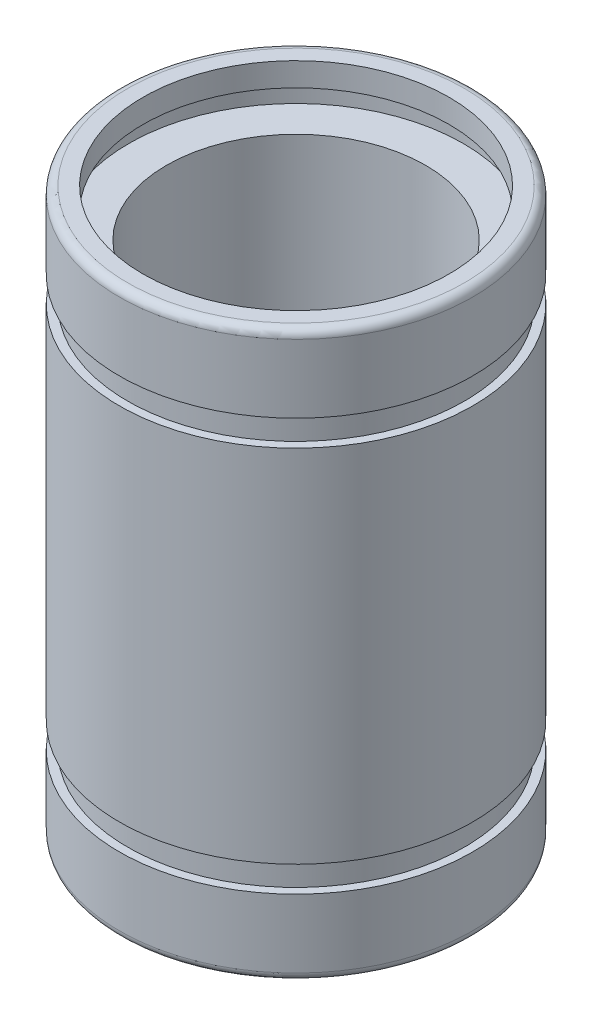
ISO-10303-21;
HEADER;
FILE_DESCRIPTION(('STEP AP214'),'2;1');
FILE_NAME('part.step','',(''),(''),'','','');
FILE_SCHEMA(('AUTOMOTIVE_DESIGN { 1 0 10303 214 1 1 1 1 }'));
ENDSEC;
DATA;
#1=APPLICATION_CONTEXT('core data for automotive mechanical design processes');
#2=APPLICATION_PROTOCOL_DEFINITION('international standard','automotive_design',2000,#1);
#3=PRODUCT_CONTEXT('',#1,'mechanical');
#4=PRODUCT('Part','Part','',(#3));
#5=PRODUCT_RELATED_PRODUCT_CATEGORY('part','',(#4));
#6=PRODUCT_DEFINITION_FORMATION('','',#4);
#7=PRODUCT_DEFINITION_CONTEXT('part definition',#1,'design');
#8=PRODUCT_DEFINITION('design','',#6,#7);
#9=PRODUCT_DEFINITION_SHAPE('','',#8);
#10=(LENGTH_UNIT() NAMED_UNIT(*) SI_UNIT(.MILLI.,.METRE.));
#11=(NAMED_UNIT(*) PLANE_ANGLE_UNIT() SI_UNIT($,.RADIAN.));
#12=(NAMED_UNIT(*) SI_UNIT($,.STERADIAN.) SOLID_ANGLE_UNIT());
#13=UNCERTAINTY_MEASURE_WITH_UNIT(LENGTH_MEASURE(1.E-05),#10,'distance_accuracy_value','');
#14=(GEOMETRIC_REPRESENTATION_CONTEXT(3) GLOBAL_UNCERTAINTY_ASSIGNED_CONTEXT((#13)) GLOBAL_UNIT_ASSIGNED_CONTEXT((#10,
#11,#12)) REPRESENTATION_CONTEXT('',''));
#15=CARTESIAN_POINT('',(0.,0.,0.));
#16=DIRECTION('',(0.,0.,1.));
#17=DIRECTION('',(1.,0.,0.));
#18=AXIS2_PLACEMENT_3D('',#15,#16,#17);
#19=CARTESIAN_POINT('',(0.,12.,0.));
#20=DIRECTION('',(0.,-1.,0.));
#21=DIRECTION('',(0.,0.,-1.));
#22=AXIS2_PLACEMENT_3D('',#19,#20,#21);
#23=CYLINDRICAL_SURFACE('',#22,7.49999999999999);
#24=CARTESIAN_POINT('',(0.,11.65,0.));
#25=DIRECTION('',(0.,-1.,0.));
#26=DIRECTION('',(0.,0.,-1.));
#27=AXIS2_PLACEMENT_3D('',#24,#25,#26);
#28=CIRCLE('',#27,7.49999999999999);
#29=CARTESIAN_POINT('',(0.,11.65,-7.5));
#30=VERTEX_POINT('',#29);
#31=EDGE_CURVE('E10',#30,#30,#28,.T.);
#32=ORIENTED_EDGE('',*,*,#31,.T.);
#33=EDGE_LOOP('',(#32));
#34=FACE_BOUND('',#33,.T.);
#35=CARTESIAN_POINT('',(0.,8.75,0.));
#36=DIRECTION('',(0.,-1.,0.));
#37=DIRECTION('',(0.,0.,-1.));
#38=AXIS2_PLACEMENT_3D('',#35,#36,#37);
#39=CIRCLE('',#38,7.49999999999999);
#40=CARTESIAN_POINT('',(0.,8.75,-7.5));
#41=VERTEX_POINT('',#40);
#42=EDGE_CURVE('E103',#41,#41,#39,.T.);
#43=ORIENTED_EDGE('',*,*,#42,.F.);
#44=EDGE_LOOP('',(#43));
#45=FACE_BOUND('',#44,.T.);
#46=ADVANCED_FACE('F33',(#34,#45),#23,.T.);
#47=CARTESIAN_POINT('',(0.,11.65,0.));
#48=DIRECTION('',(0.,-1.,0.));
#49=DIRECTION('',(0.,0.,-1.));
#50=AXIS2_PLACEMENT_3D('',#47,#48,#49);
#51=TOROIDAL_SURFACE('',#50,7.14999999999999,0.350000000000003);
#52=CARTESIAN_POINT('',(0.,12.,0.));
#53=DIRECTION('',(0.,-1.,0.));
#54=DIRECTION('',(0.,0.,-1.));
#55=AXIS2_PLACEMENT_3D('',#52,#53,#54);
#56=CIRCLE('',#55,7.14999999999999);
#57=CARTESIAN_POINT('',(0.,12.,-7.15));
#58=VERTEX_POINT('',#57);
#59=EDGE_CURVE('E39',#58,#58,#56,.T.);
#60=ORIENTED_EDGE('',*,*,#59,.T.);
#61=EDGE_LOOP('',(#60));
#62=FACE_BOUND('',#61,.T.);
#63=ORIENTED_EDGE('',*,*,#31,.F.);
#64=EDGE_LOOP('',(#63));
#65=FACE_BOUND('',#64,.T.);
#66=ADVANCED_FACE('F111',(#62,#65),#51,.T.);
#67=CARTESIAN_POINT('',(0.,12.,0.));
#68=DIRECTION('',(0.,1.,0.));
#69=DIRECTION('',(0.,0.,1.));
#70=AXIS2_PLACEMENT_3D('',#67,#68,#69);
#71=PLANE('',#70);
#72=CARTESIAN_POINT('',(0.,12.,0.));
#73=DIRECTION('',(0.,-1.,0.));
#74=DIRECTION('',(0.,0.,-1.));
#75=AXIS2_PLACEMENT_3D('',#72,#73,#74);
#76=CIRCLE('',#75,6.49999999999999);
#77=CARTESIAN_POINT('',(0.,12.,-6.5));
#78=VERTEX_POINT('',#77);
#79=EDGE_CURVE('E43',#78,#78,#76,.T.);
#80=ORIENTED_EDGE('',*,*,#79,.T.);
#81=EDGE_LOOP('',(#80));
#82=FACE_BOUND('',#81,.T.);
#83=ORIENTED_EDGE('',*,*,#59,.F.);
#84=EDGE_LOOP('',(#83));
#85=FACE_BOUND('',#84,.T.);
#86=ADVANCED_FACE('F115',(#82,#85),#71,.T.);
#87=CARTESIAN_POINT('',(0.,12.,0.));
#88=DIRECTION('',(0.,-1.,0.));
#89=DIRECTION('',(0.,0.,-1.));
#90=AXIS2_PLACEMENT_3D('',#87,#88,#89);
#91=CYLINDRICAL_SURFACE('',#90,6.49999999999999);
#92=CARTESIAN_POINT('',(0.,11.,0.));
#93=DIRECTION('',(0.,-1.,0.));
#94=DIRECTION('',(0.,0.,-1.));
#95=AXIS2_PLACEMENT_3D('',#92,#93,#94);
#96=CIRCLE('',#95,6.49999999999999);
#97=CARTESIAN_POINT('',(0.,11.,-6.5));
#98=VERTEX_POINT('',#97);
#99=EDGE_CURVE('E47',#98,#98,#96,.T.);
#100=ORIENTED_EDGE('',*,*,#99,.T.);
#101=EDGE_LOOP('',(#100));
#102=FACE_BOUND('',#101,.T.);
#103=ORIENTED_EDGE('',*,*,#79,.F.);
#104=EDGE_LOOP('',(#103));
#105=FACE_BOUND('',#104,.T.);
#106=ADVANCED_FACE('F119',(#102,#105),#91,.F.);
#107=CARTESIAN_POINT('',(0.,11.,0.));
#108=DIRECTION('',(0.,-1.,0.));
#109=DIRECTION('',(0.,0.,-1.));
#110=AXIS2_PLACEMENT_3D('',#107,#108,#109);
#111=PLANE('',#110);
#112=CARTESIAN_POINT('',(0.,11.,0.));
#113=DIRECTION('',(0.,-1.,0.));
#114=DIRECTION('',(0.,0.,-1.));
#115=AXIS2_PLACEMENT_3D('',#112,#113,#114);
#116=CIRCLE('',#115,7.1);
#117=CARTESIAN_POINT('',(0.,11.,-7.1));
#118=VERTEX_POINT('',#117);
#119=EDGE_CURVE('E52',#118,#118,#116,.T.);
#120=ORIENTED_EDGE('',*,*,#119,.T.);
#121=EDGE_LOOP('',(#120));
#122=FACE_BOUND('',#121,.T.);
#123=ORIENTED_EDGE('',*,*,#99,.F.);
#124=EDGE_LOOP('',(#123));
#125=FACE_BOUND('',#124,.T.);
#126=ADVANCED_FACE('F126',(#122,#125),#111,.T.);
#127=CARTESIAN_POINT('',(0.,12.,0.));
#128=DIRECTION('',(0.,-1.,0.));
#129=DIRECTION('',(0.,0.,-1.));
#130=AXIS2_PLACEMENT_3D('',#127,#128,#129);
#131=CYLINDRICAL_SURFACE('',#130,7.1);
#132=CARTESIAN_POINT('',(0.,9.99999999999999,0.));
#133=DIRECTION('',(0.,-1.,0.));
#134=DIRECTION('',(0.,0.,-1.));
#135=AXIS2_PLACEMENT_3D('',#132,#133,#134);
#136=CIRCLE('',#135,7.1);
#137=CARTESIAN_POINT('',(0.,9.99999999999999,-7.1));
#138=VERTEX_POINT('',#137);
#139=EDGE_CURVE('E55',#138,#138,#136,.T.);
#140=ORIENTED_EDGE('',*,*,#139,.T.);
#141=EDGE_LOOP('',(#140));
#142=FACE_BOUND('',#141,.T.);
#143=ORIENTED_EDGE('',*,*,#119,.F.);
#144=EDGE_LOOP('',(#143));
#145=FACE_BOUND('',#144,.T.);
#146=ADVANCED_FACE('F130',(#142,#145),#131,.F.);
#147=CARTESIAN_POINT('',(0.,9.99999999999999,0.));
#148=DIRECTION('',(0.,1.,0.));
#149=DIRECTION('',(0.,0.,1.));
#150=AXIS2_PLACEMENT_3D('',#147,#148,#149);
#151=PLANE('',#150);
#152=CARTESIAN_POINT('',(0.,9.99999999999999,0.));
#153=DIRECTION('',(0.,-1.,0.));
#154=DIRECTION('',(0.,0.,-1.));
#155=AXIS2_PLACEMENT_3D('',#152,#153,#154);
#156=CIRCLE('',#155,5.50000000000001);
#157=CARTESIAN_POINT('',(0.,9.99999999999999,-5.50000000000001));
#158=VERTEX_POINT('',#157);
#159=EDGE_CURVE('E58',#158,#158,#156,.T.);
#160=ORIENTED_EDGE('',*,*,#159,.T.);
#161=EDGE_LOOP('',(#160));
#162=FACE_BOUND('',#161,.T.);
#163=ORIENTED_EDGE('',*,*,#139,.F.);
#164=EDGE_LOOP('',(#163));
#165=FACE_BOUND('',#164,.T.);
#166=ADVANCED_FACE('F134',(#162,#165),#151,.T.);
#167=CARTESIAN_POINT('',(0.,12.,0.));
#168=DIRECTION('',(0.,-1.,0.));
#169=DIRECTION('',(0.,0.,-1.));
#170=AXIS2_PLACEMENT_3D('',#167,#168,#169);
#171=CYLINDRICAL_SURFACE('',#170,5.50000000000001);
#172=CARTESIAN_POINT('',(0.,-9.99999999999999,0.));
#173=DIRECTION('',(0.,-1.,0.));
#174=DIRECTION('',(0.,0.,-1.));
#175=AXIS2_PLACEMENT_3D('',#172,#173,#174);
#176=CIRCLE('',#175,5.50000000000001);
#177=CARTESIAN_POINT('',(0.,-9.99999999999999,-5.50000000000002));
#178=VERTEX_POINT('',#177);
#179=EDGE_CURVE('E61',#178,#178,#176,.T.);
#180=ORIENTED_EDGE('',*,*,#179,.T.);
#181=EDGE_LOOP('',(#180));
#182=FACE_BOUND('',#181,.T.);
#183=ORIENTED_EDGE('',*,*,#159,.F.);
#184=EDGE_LOOP('',(#183));
#185=FACE_BOUND('',#184,.T.);
#186=ADVANCED_FACE('F138',(#182,#185),#171,.F.);
#187=CARTESIAN_POINT('',(0.,-9.99999999999999,0.));
#188=DIRECTION('',(0.,1.,0.));
#189=DIRECTION('',(0.,0.,1.));
#190=AXIS2_PLACEMENT_3D('',#187,#188,#189);
#191=PLANE('',#190);
#192=ORIENTED_EDGE('',*,*,#179,.F.);
#193=EDGE_LOOP('',(#192));
#194=FACE_BOUND('',#193,.T.);
#195=CARTESIAN_POINT('',(0.,-9.99999999999999,0.));
#196=DIRECTION('',(0.,-1.,0.));
#197=DIRECTION('',(0.,0.,-1.));
#198=AXIS2_PLACEMENT_3D('',#195,#196,#197);
#199=CIRCLE('',#198,7.1);
#200=CARTESIAN_POINT('',(0.,-9.99999999999999,-7.10000000000001));
#201=VERTEX_POINT('',#200);
#202=EDGE_CURVE('E64',#201,#201,#199,.T.);
#203=ORIENTED_EDGE('',*,*,#202,.T.);
#204=EDGE_LOOP('',(#203));
#205=FACE_BOUND('',#204,.T.);
#206=ADVANCED_FACE('F142',(#194,#205),#191,.F.);
#207=CARTESIAN_POINT('',(0.,12.,0.));
#208=DIRECTION('',(0.,-1.,0.));
#209=DIRECTION('',(0.,0.,-1.));
#210=AXIS2_PLACEMENT_3D('',#207,#208,#209);
#211=CYLINDRICAL_SURFACE('',#210,7.1);
#212=ORIENTED_EDGE('',*,*,#202,.F.);
#213=EDGE_LOOP('',(#212));
#214=FACE_BOUND('',#213,.T.);
#215=CARTESIAN_POINT('',(0.,-11.,0.));
#216=DIRECTION('',(0.,-1.,0.));
#217=DIRECTION('',(0.,0.,-1.));
#218=AXIS2_PLACEMENT_3D('',#215,#216,#217);
#219=CIRCLE('',#218,7.1);
#220=CARTESIAN_POINT('',(0.,-11.,-7.10000000000001));
#221=VERTEX_POINT('',#220);
#222=EDGE_CURVE('E67',#221,#221,#219,.T.);
#223=ORIENTED_EDGE('',*,*,#222,.T.);
#224=EDGE_LOOP('',(#223));
#225=FACE_BOUND('',#224,.T.);
#226=ADVANCED_FACE('F146',(#214,#225),#211,.F.);
#227=CARTESIAN_POINT('',(0.,-11.,0.));
#228=DIRECTION('',(0.,-1.,0.));
#229=DIRECTION('',(0.,0.,-1.));
#230=AXIS2_PLACEMENT_3D('',#227,#228,#229);
#231=PLANE('',#230);
#232=ORIENTED_EDGE('',*,*,#222,.F.);
#233=EDGE_LOOP('',(#232));
#234=FACE_BOUND('',#233,.T.);
#235=CARTESIAN_POINT('',(0.,-11.,0.));
#236=DIRECTION('',(0.,-1.,0.));
#237=DIRECTION('',(0.,0.,-1.));
#238=AXIS2_PLACEMENT_3D('',#235,#236,#237);
#239=CIRCLE('',#238,6.5);
#240=CARTESIAN_POINT('',(0.,-11.,-6.5));
#241=VERTEX_POINT('',#240);
#242=EDGE_CURVE('E70',#241,#241,#239,.T.);
#243=ORIENTED_EDGE('',*,*,#242,.T.);
#244=EDGE_LOOP('',(#243));
#245=FACE_BOUND('',#244,.T.);
#246=ADVANCED_FACE('F150',(#234,#245),#231,.F.);
#247=CARTESIAN_POINT('',(0.,12.,0.));
#248=DIRECTION('',(0.,-1.,0.));
#249=DIRECTION('',(0.,0.,-1.));
#250=AXIS2_PLACEMENT_3D('',#247,#248,#249);
#251=CYLINDRICAL_SURFACE('',#250,6.5);
#252=ORIENTED_EDGE('',*,*,#242,.F.);
#253=EDGE_LOOP('',(#252));
#254=FACE_BOUND('',#253,.T.);
#255=CARTESIAN_POINT('',(0.,-12.,0.));
#256=DIRECTION('',(0.,-1.,0.));
#257=DIRECTION('',(0.,0.,-1.));
#258=AXIS2_PLACEMENT_3D('',#255,#256,#257);
#259=CIRCLE('',#258,6.5);
#260=CARTESIAN_POINT('',(0.,-12.,-6.5));
#261=VERTEX_POINT('',#260);
#262=EDGE_CURVE('E73',#261,#261,#259,.T.);
#263=ORIENTED_EDGE('',*,*,#262,.T.);
#264=EDGE_LOOP('',(#263));
#265=FACE_BOUND('',#264,.T.);
#266=ADVANCED_FACE('F154',(#254,#265),#251,.F.);
#267=CARTESIAN_POINT('',(0.,-12.,0.));
#268=DIRECTION('',(0.,1.,0.));
#269=DIRECTION('',(0.,0.,1.));
#270=AXIS2_PLACEMENT_3D('',#267,#268,#269);
#271=PLANE('',#270);
#272=ORIENTED_EDGE('',*,*,#262,.F.);
#273=EDGE_LOOP('',(#272));
#274=FACE_BOUND('',#273,.T.);
#275=CARTESIAN_POINT('',(0.,-12.,0.));
#276=DIRECTION('',(0.,-1.,0.));
#277=DIRECTION('',(0.,0.,-1.));
#278=AXIS2_PLACEMENT_3D('',#275,#276,#277);
#279=CIRCLE('',#278,7.15);
#280=CARTESIAN_POINT('',(0.,-12.,-7.15));
#281=VERTEX_POINT('',#280);
#282=EDGE_CURVE('E76',#281,#281,#279,.T.);
#283=ORIENTED_EDGE('',*,*,#282,.T.);
#284=EDGE_LOOP('',(#283));
#285=FACE_BOUND('',#284,.T.);
#286=ADVANCED_FACE('F158',(#274,#285),#271,.F.);
#287=CARTESIAN_POINT('',(0.,-11.65,0.));
#288=DIRECTION('',(0.,-1.,0.));
#289=DIRECTION('',(0.,0.,-1.));
#290=AXIS2_PLACEMENT_3D('',#287,#288,#289);
#291=TOROIDAL_SURFACE('',#290,7.15,0.350000000000003);
#292=ORIENTED_EDGE('',*,*,#282,.F.);
#293=EDGE_LOOP('',(#292));
#294=FACE_BOUND('',#293,.T.);
#295=CARTESIAN_POINT('',(0.,-11.65,0.));
#296=DIRECTION('',(0.,-1.,0.));
#297=DIRECTION('',(0.,0.,-1.));
#298=AXIS2_PLACEMENT_3D('',#295,#296,#297);
#299=CIRCLE('',#298,7.5);
#300=CARTESIAN_POINT('',(0.,-11.65,-7.5));
#301=VERTEX_POINT('',#300);
#302=EDGE_CURVE('E79',#301,#301,#299,.T.);
#303=ORIENTED_EDGE('',*,*,#302,.T.);
#304=EDGE_LOOP('',(#303));
#305=FACE_BOUND('',#304,.T.);
#306=ADVANCED_FACE('F162',(#294,#305),#291,.T.);
#307=CARTESIAN_POINT('',(0.,12.,0.));
#308=DIRECTION('',(0.,-1.,0.));
#309=DIRECTION('',(0.,0.,-1.));
#310=AXIS2_PLACEMENT_3D('',#307,#308,#309);
#311=CYLINDRICAL_SURFACE('',#310,7.5);
#312=CARTESIAN_POINT('',(0.,-8.75,0.));
#313=DIRECTION('',(0.,-1.,0.));
#314=DIRECTION('',(0.,0.,-1.));
#315=AXIS2_PLACEMENT_3D('',#312,#313,#314);
#316=CIRCLE('',#315,7.5);
#317=CARTESIAN_POINT('',(0.,-8.75,-7.5));
#318=VERTEX_POINT('',#317);
#319=EDGE_CURVE('E82',#318,#318,#316,.T.);
#320=ORIENTED_EDGE('',*,*,#319,.T.);
#321=EDGE_LOOP('',(#320));
#322=FACE_BOUND('',#321,.T.);
#323=ORIENTED_EDGE('',*,*,#302,.F.);
#324=EDGE_LOOP('',(#323));
#325=FACE_BOUND('',#324,.T.);
#326=ADVANCED_FACE('F166',(#322,#325),#311,.T.);
#327=CARTESIAN_POINT('',(0.,-8.75,0.));
#328=DIRECTION('',(0.,-1.,0.));
#329=DIRECTION('',(0.,0.,-1.));
#330=AXIS2_PLACEMENT_3D('',#327,#328,#329);
#331=PLANE('',#330);
#332=ORIENTED_EDGE('',*,*,#319,.F.);
#333=EDGE_LOOP('',(#332));
#334=FACE_BOUND('',#333,.T.);
#335=CARTESIAN_POINT('',(0.,-8.75,0.));
#336=DIRECTION('',(0.,-1.,0.));
#337=DIRECTION('',(0.,0.,-1.));
#338=AXIS2_PLACEMENT_3D('',#335,#336,#337);
#339=CIRCLE('',#338,7.15);
#340=CARTESIAN_POINT('',(0.,-8.75,-7.15));
#341=VERTEX_POINT('',#340);
#342=EDGE_CURVE('E85',#341,#341,#339,.T.);
#343=ORIENTED_EDGE('',*,*,#342,.T.);
#344=EDGE_LOOP('',(#343));
#345=FACE_BOUND('',#344,.T.);
#346=ADVANCED_FACE('F170',(#334,#345),#331,.F.);
#347=CARTESIAN_POINT('',(0.,12.,0.));
#348=DIRECTION('',(0.,-1.,0.));
#349=DIRECTION('',(0.,0.,-1.));
#350=AXIS2_PLACEMENT_3D('',#347,#348,#349);
#351=CYLINDRICAL_SURFACE('',#350,7.15);
#352=ORIENTED_EDGE('',*,*,#342,.F.);
#353=EDGE_LOOP('',(#352));
#354=FACE_BOUND('',#353,.T.);
#355=CARTESIAN_POINT('',(0.,-7.65,0.));
#356=DIRECTION('',(0.,-1.,0.));
#357=DIRECTION('',(0.,0.,-1.));
#358=AXIS2_PLACEMENT_3D('',#355,#356,#357);
#359=CIRCLE('',#358,7.15);
#360=CARTESIAN_POINT('',(0.,-7.65,-7.15));
#361=VERTEX_POINT('',#360);
#362=EDGE_CURVE('E88',#361,#361,#359,.T.);
#363=ORIENTED_EDGE('',*,*,#362,.T.);
#364=EDGE_LOOP('',(#363));
#365=FACE_BOUND('',#364,.T.);
#366=ADVANCED_FACE('F174',(#354,#365),#351,.T.);
#367=CARTESIAN_POINT('',(0.,-7.65,0.));
#368=DIRECTION('',(0.,1.,0.));
#369=DIRECTION('',(0.,0.,1.));
#370=AXIS2_PLACEMENT_3D('',#367,#368,#369);
#371=PLANE('',#370);
#372=ORIENTED_EDGE('',*,*,#362,.F.);
#373=EDGE_LOOP('',(#372));
#374=FACE_BOUND('',#373,.T.);
#375=CARTESIAN_POINT('',(0.,-7.65,0.));
#376=DIRECTION('',(0.,-1.,0.));
#377=DIRECTION('',(0.,0.,-1.));
#378=AXIS2_PLACEMENT_3D('',#375,#376,#377);
#379=CIRCLE('',#378,7.5);
#380=CARTESIAN_POINT('',(0.,-7.65,-7.5));
#381=VERTEX_POINT('',#380);
#382=EDGE_CURVE('E91',#381,#381,#379,.T.);
#383=ORIENTED_EDGE('',*,*,#382,.T.);
#384=EDGE_LOOP('',(#383));
#385=FACE_BOUND('',#384,.T.);
#386=ADVANCED_FACE('F178',(#374,#385),#371,.F.);
#387=CARTESIAN_POINT('',(0.,12.,0.));
#388=DIRECTION('',(0.,-1.,0.));
#389=DIRECTION('',(0.,0.,-1.));
#390=AXIS2_PLACEMENT_3D('',#387,#388,#389);
#391=CYLINDRICAL_SURFACE('',#390,7.5);
#392=CARTESIAN_POINT('',(0.,7.65,0.));
#393=DIRECTION('',(0.,-1.,0.));
#394=DIRECTION('',(0.,0.,-1.));
#395=AXIS2_PLACEMENT_3D('',#392,#393,#394);
#396=CIRCLE('',#395,7.49999999999999);
#397=CARTESIAN_POINT('',(0.,7.65,-7.5));
#398=VERTEX_POINT('',#397);
#399=EDGE_CURVE('E94',#398,#398,#396,.T.);
#400=ORIENTED_EDGE('',*,*,#399,.T.);
#401=EDGE_LOOP('',(#400));
#402=FACE_BOUND('',#401,.T.);
#403=ORIENTED_EDGE('',*,*,#382,.F.);
#404=EDGE_LOOP('',(#403));
#405=FACE_BOUND('',#404,.T.);
#406=ADVANCED_FACE('F182',(#402,#405),#391,.T.);
#407=CARTESIAN_POINT('',(0.,7.65,0.));
#408=DIRECTION('',(0.,1.,0.));
#409=DIRECTION('',(0.,0.,1.));
#410=AXIS2_PLACEMENT_3D('',#407,#408,#409);
#411=PLANE('',#410);
#412=CARTESIAN_POINT('',(0.,7.65,0.));
#413=DIRECTION('',(0.,-1.,0.));
#414=DIRECTION('',(0.,0.,-1.));
#415=AXIS2_PLACEMENT_3D('',#412,#413,#414);
#416=CIRCLE('',#415,7.15);
#417=CARTESIAN_POINT('',(0.,7.65,-7.15));
#418=VERTEX_POINT('',#417);
#419=EDGE_CURVE('E97',#418,#418,#416,.T.);
#420=ORIENTED_EDGE('',*,*,#419,.T.);
#421=EDGE_LOOP('',(#420));
#422=FACE_BOUND('',#421,.T.);
#423=ORIENTED_EDGE('',*,*,#399,.F.);
#424=EDGE_LOOP('',(#423));
#425=FACE_BOUND('',#424,.T.);
#426=ADVANCED_FACE('F186',(#422,#425),#411,.T.);
#427=CARTESIAN_POINT('',(0.,12.,0.));
#428=DIRECTION('',(0.,-1.,0.));
#429=DIRECTION('',(0.,0.,-1.));
#430=AXIS2_PLACEMENT_3D('',#427,#428,#429);
#431=CYLINDRICAL_SURFACE('',#430,7.15);
#432=CARTESIAN_POINT('',(0.,8.75,0.));
#433=DIRECTION('',(0.,-1.,0.));
#434=DIRECTION('',(0.,0.,-1.));
#435=AXIS2_PLACEMENT_3D('',#432,#433,#434);
#436=CIRCLE('',#435,7.15);
#437=CARTESIAN_POINT('',(0.,8.75,-7.15));
#438=VERTEX_POINT('',#437);
#439=EDGE_CURVE('E100',#438,#438,#436,.T.);
#440=ORIENTED_EDGE('',*,*,#439,.T.);
#441=EDGE_LOOP('',(#440));
#442=FACE_BOUND('',#441,.T.);
#443=ORIENTED_EDGE('',*,*,#419,.F.);
#444=EDGE_LOOP('',(#443));
#445=FACE_BOUND('',#444,.T.);
#446=ADVANCED_FACE('F190',(#442,#445),#431,.T.);
#447=CARTESIAN_POINT('',(0.,8.75,0.));
#448=DIRECTION('',(0.,-1.,0.));
#449=DIRECTION('',(0.,0.,-1.));
#450=AXIS2_PLACEMENT_3D('',#447,#448,#449);
#451=PLANE('',#450);
#452=ORIENTED_EDGE('',*,*,#42,.T.);
#453=EDGE_LOOP('',(#452));
#454=FACE_BOUND('',#453,.T.);
#455=ORIENTED_EDGE('',*,*,#439,.F.);
#456=EDGE_LOOP('',(#455));
#457=FACE_BOUND('',#456,.T.);
#458=ADVANCED_FACE('F107',(#454,#457),#451,.T.);
#459=CLOSED_SHELL('',(#46,#66,#86,#106,#126,#146,#166,#186,#206,#226,#246,#266,#286,#306,#326,
#346,#366,#386,#406,#426,#446,#458));
#460=MANIFOLD_SOLID_BREP('B2',#459);
#461=ADVANCED_BREP_SHAPE_REPRESENTATION('',(#18,#460),#14);
#462=SHAPE_DEFINITION_REPRESENTATION(#9,#461);
ENDSEC;
END-ISO-10303-21;
